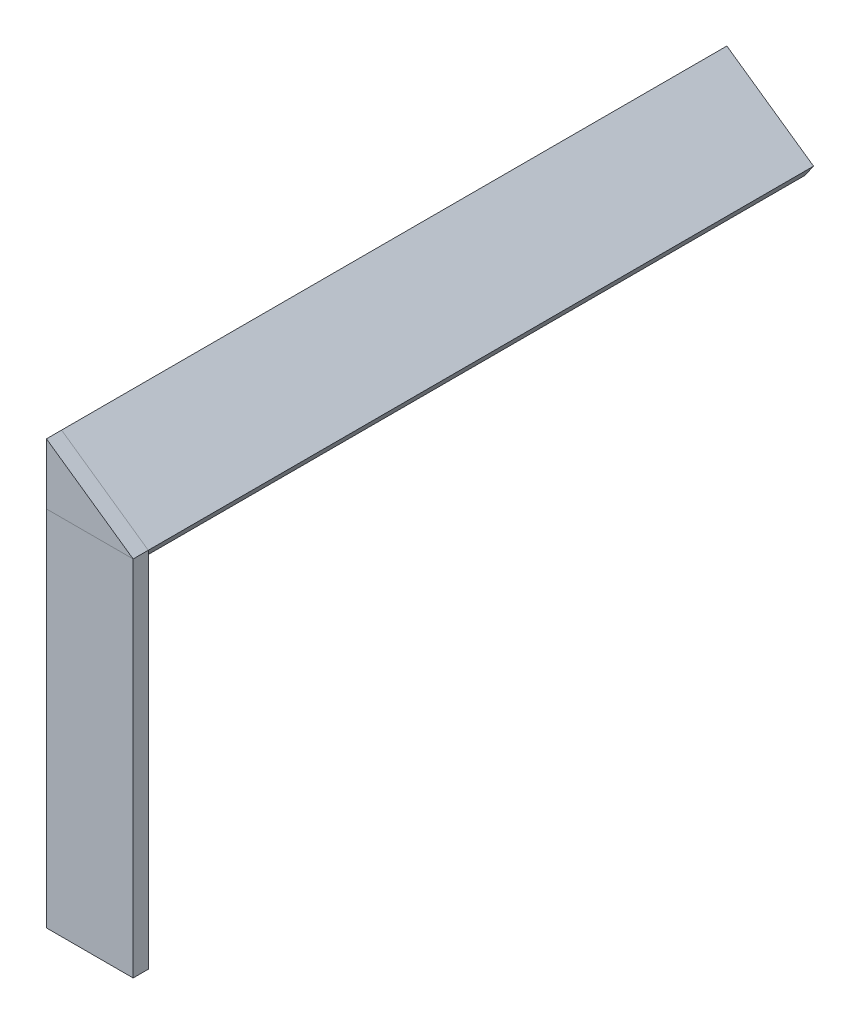
ISO-10303-21;
HEADER;
FILE_DESCRIPTION(('STEP AP214'),'2;1');
FILE_NAME('part.step','',(''),(''),'','','');
FILE_SCHEMA(('AUTOMOTIVE_DESIGN { 1 0 10303 214 1 1 1 1 }'));
ENDSEC;
DATA;
#1=APPLICATION_CONTEXT('core data for automotive mechanical design processes');
#2=APPLICATION_PROTOCOL_DEFINITION('international standard','automotive_design',2000,#1);
#3=PRODUCT_CONTEXT('',#1,'mechanical');
#4=PRODUCT('Part','Part','',(#3));
#5=PRODUCT_RELATED_PRODUCT_CATEGORY('part','',(#4));
#6=PRODUCT_DEFINITION_FORMATION('','',#4);
#7=PRODUCT_DEFINITION_CONTEXT('part definition',#1,'design');
#8=PRODUCT_DEFINITION('design','',#6,#7);
#9=PRODUCT_DEFINITION_SHAPE('','',#8);
#10=(LENGTH_UNIT() NAMED_UNIT(*) SI_UNIT(.MILLI.,.METRE.));
#11=(NAMED_UNIT(*) PLANE_ANGLE_UNIT() SI_UNIT($,.RADIAN.));
#12=(NAMED_UNIT(*) SI_UNIT($,.STERADIAN.) SOLID_ANGLE_UNIT());
#13=UNCERTAINTY_MEASURE_WITH_UNIT(LENGTH_MEASURE(1.E-05),#10,'distance_accuracy_value','');
#14=(GEOMETRIC_REPRESENTATION_CONTEXT(3) GLOBAL_UNCERTAINTY_ASSIGNED_CONTEXT((#13)) GLOBAL_UNIT_ASSIGNED_CONTEXT((#10,
#11,#12)) REPRESENTATION_CONTEXT('',''));
#15=CARTESIAN_POINT('',(0.,0.,0.));
#16=DIRECTION('',(0.,0.,1.));
#17=DIRECTION('',(1.,0.,0.));
#18=AXIS2_PLACEMENT_3D('',#15,#16,#17);
#19=CARTESIAN_POINT('',(-18.2056541843228,25.4954725958042,-279.4));
#20=DIRECTION('',(-0.819152044288989,0.57357643635105,0.));
#21=DIRECTION('',(-0.57357643635105,-0.819152044288989,0.));
#22=AXIS2_PLACEMENT_3D('',#19,#20,#21);
#23=PLANE('',#22);
#24=DIRECTION('',(-0.57357643635105,-0.819152044288989,0.));
#25=VECTOR('',#24,1.);
#26=CARTESIAN_POINT('',(-18.2056541843228,25.4954725958042,0.));
#27=LINE('',#26,#25);
#28=CARTESIAN_POINT('',(-18.2056541843228,25.4954725958042,0.));
#29=VERTEX_POINT('',#28);
#30=CARTESIAN_POINT('',(-21.8478645551519,20.2938571145691,0.));
#31=VERTEX_POINT('',#30);
#32=EDGE_CURVE('E124',#29,#31,#27,.T.);
#33=ORIENTED_EDGE('',*,*,#32,.F.);
#34=DIRECTION('',(0.,0.,1.));
#35=VECTOR('',#34,1.);
#36=CARTESIAN_POINT('',(-18.2056541843228,25.4954725958042,-279.4));
#37=LINE('',#36,#35);
#38=CARTESIAN_POINT('',(-18.2056541843228,25.4954725958042,-279.4));
#39=VERTEX_POINT('',#38);
#40=EDGE_CURVE('E13',#39,#29,#37,.T.);
#41=ORIENTED_EDGE('',*,*,#40,.F.);
#42=DIRECTION('',(-0.57357643635105,-0.819152044288989,0.));
#43=VECTOR('',#42,1.);
#44=CARTESIAN_POINT('',(-18.2056541843228,25.4954725958042,-279.4));
#45=LINE('',#44,#43);
#46=CARTESIAN_POINT('',(-21.8478645551519,20.2938571145691,-279.4));
#47=VERTEX_POINT('',#46);
#48=EDGE_CURVE('E115',#39,#47,#45,.T.);
#49=ORIENTED_EDGE('',*,*,#48,.T.);
#50=DIRECTION('',(0.,0.,1.));
#51=VECTOR('',#50,1.);
#52=CARTESIAN_POINT('',(-21.8478645551519,20.2938571145691,-279.4));
#53=LINE('',#52,#51);
#54=EDGE_CURVE('E57',#47,#31,#53,.T.);
#55=ORIENTED_EDGE('',*,*,#54,.T.);
#56=EDGE_LOOP('',(#33,#41,#49,#55));
#57=FACE_BOUND('',#56,.T.);
#58=ADVANCED_FACE('F54',(#57),#23,.T.);
#59=CARTESIAN_POINT('',(-18.2056541843228,25.4954725958042,-279.4));
#60=DIRECTION('',(0.57357643635105,0.819152044288989,0.));
#61=DIRECTION('',(-0.819152044288989,0.57357643635105,0.));
#62=AXIS2_PLACEMENT_3D('',#59,#60,#61);
#63=PLANE('',#62);
#64=DIRECTION('',(-0.819152044288989,0.57357643635105,0.));
#65=VECTOR('',#64,1.);
#66=CARTESIAN_POINT('',(-18.2056541843228,25.4954725958042,0.));
#67=LINE('',#66,#65);
#68=CARTESIAN_POINT('',(18.2056541843228,0.,0.));
#69=VERTEX_POINT('',#68);
#70=EDGE_CURVE('E118',#69,#29,#67,.T.);
#71=ORIENTED_EDGE('',*,*,#70,.F.);
#72=DIRECTION('',(0.,0.,1.));
#73=VECTOR('',#72,1.);
#74=CARTESIAN_POINT('',(18.2056541843228,0.,-279.4));
#75=LINE('',#74,#73);
#76=CARTESIAN_POINT('',(18.2056541843228,0.,-279.4));
#77=VERTEX_POINT('',#76);
#78=EDGE_CURVE('E64',#77,#69,#75,.T.);
#79=ORIENTED_EDGE('',*,*,#78,.F.);
#80=DIRECTION('',(-0.819152044288989,0.57357643635105,0.));
#81=VECTOR('',#80,1.);
#82=CARTESIAN_POINT('',(-18.2056541843228,25.4954725958042,-279.4));
#83=LINE('',#82,#81);
#84=EDGE_CURVE('E110',#77,#39,#83,.T.);
#85=ORIENTED_EDGE('',*,*,#84,.T.);
#86=ORIENTED_EDGE('',*,*,#40,.T.);
#87=EDGE_LOOP('',(#71,#79,#85,#86));
#88=FACE_BOUND('',#87,.T.);
#89=ADVANCED_FACE('F145',(#88),#63,.T.);
#90=CARTESIAN_POINT('',(18.2056541843228,0.,-279.4));
#91=DIRECTION('',(0.819152044288989,-0.57357643635105,0.));
#92=DIRECTION('',(0.57357643635105,0.819152044288989,0.));
#93=AXIS2_PLACEMENT_3D('',#90,#91,#92);
#94=PLANE('',#93);
#95=DIRECTION('',(0.57357643635105,0.819152044288989,0.));
#96=VECTOR('',#95,1.);
#97=CARTESIAN_POINT('',(18.2056541843228,0.,0.));
#98=LINE('',#97,#96);
#99=CARTESIAN_POINT('',(14.5634438134936,-5.20161548123509,0.));
#100=VERTEX_POINT('',#99);
#101=EDGE_CURVE('E104',#100,#69,#98,.T.);
#102=ORIENTED_EDGE('',*,*,#101,.F.);
#103=DIRECTION('',(0.,0.,1.));
#104=VECTOR('',#103,1.);
#105=CARTESIAN_POINT('',(14.5634438134936,-5.20161548123509,-279.4));
#106=LINE('',#105,#104);
#107=CARTESIAN_POINT('',(14.5634438134936,-5.20161548123509,-279.4));
#108=VERTEX_POINT('',#107);
#109=EDGE_CURVE('E99',#108,#100,#106,.T.);
#110=ORIENTED_EDGE('',*,*,#109,.F.);
#111=DIRECTION('',(0.57357643635105,0.819152044288989,0.));
#112=VECTOR('',#111,1.);
#113=CARTESIAN_POINT('',(18.2056541843228,0.,-279.4));
#114=LINE('',#113,#112);
#115=EDGE_CURVE('E102',#108,#77,#114,.T.);
#116=ORIENTED_EDGE('',*,*,#115,.T.);
#117=ORIENTED_EDGE('',*,*,#78,.T.);
#118=EDGE_LOOP('',(#102,#110,#116,#117));
#119=FACE_BOUND('',#118,.T.);
#120=ADVANCED_FACE('F101',(#119),#94,.T.);
#121=CARTESIAN_POINT('',(-21.8478645551519,20.2938571145691,-279.4));
#122=DIRECTION('',(-0.57357643635105,-0.819152044288989,0.));
#123=DIRECTION('',(0.819152044288989,-0.57357643635105,0.));
#124=AXIS2_PLACEMENT_3D('',#121,#122,#123);
#125=PLANE('',#124);
#126=DIRECTION('',(0.819152044288989,-0.57357643635105,0.));
#127=VECTOR('',#126,1.);
#128=CARTESIAN_POINT('',(-21.8478645551519,20.2938571145691,0.));
#129=LINE('',#128,#127);
#130=EDGE_CURVE('E138',#31,#100,#129,.T.);
#131=ORIENTED_EDGE('',*,*,#130,.F.);
#132=ORIENTED_EDGE('',*,*,#54,.F.);
#133=DIRECTION('',(0.819152044288989,-0.57357643635105,0.));
#134=VECTOR('',#133,1.);
#135=CARTESIAN_POINT('',(-21.8478645551519,20.2938571145691,-279.4));
#136=LINE('',#135,#134);
#137=EDGE_CURVE('E109',#47,#108,#136,.T.);
#138=ORIENTED_EDGE('',*,*,#137,.T.);
#139=ORIENTED_EDGE('',*,*,#109,.T.);
#140=EDGE_LOOP('',(#131,#132,#138,#139));
#141=FACE_BOUND('',#140,.T.);
#142=ADVANCED_FACE('F113',(#141),#125,.T.);
#143=CARTESIAN_POINT('',(0.,0.,-279.4));
#144=DIRECTION('',(0.,0.,1.));
#145=DIRECTION('',(1.,0.,0.));
#146=AXIS2_PLACEMENT_3D('',#143,#144,#145);
#147=PLANE('',#146);
#148=ORIENTED_EDGE('',*,*,#48,.F.);
#149=ORIENTED_EDGE('',*,*,#84,.F.);
#150=ORIENTED_EDGE('',*,*,#115,.F.);
#151=ORIENTED_EDGE('',*,*,#137,.F.);
#152=EDGE_LOOP('',(#148,#149,#150,#151));
#153=FACE_BOUND('',#152,.T.);
#154=ADVANCED_FACE('F108',(#153),#147,.F.);
#155=CARTESIAN_POINT('',(0.,0.,0.));
#156=DIRECTION('',(0.,0.,1.));
#157=DIRECTION('',(1.,0.,0.));
#158=AXIS2_PLACEMENT_3D('',#155,#156,#157);
#159=PLANE('',#158);
#160=ORIENTED_EDGE('',*,*,#32,.T.);
#161=ORIENTED_EDGE('',*,*,#130,.T.);
#162=ORIENTED_EDGE('',*,*,#101,.T.);
#163=ORIENTED_EDGE('',*,*,#70,.T.);
#164=EDGE_LOOP('',(#160,#161,#162,#163));
#165=FACE_BOUND('',#164,.T.);
#166=ADVANCED_FACE('F143',(#165),#159,.T.);
#167=CLOSED_SHELL('',(#58,#89,#120,#142,#154,#166));
#168=MANIFOLD_SOLID_BREP('B2',#167);
#169=CARTESIAN_POINT('',(-18.2056541843228,0.,6.35));
#170=DIRECTION('',(1.,0.,0.));
#171=DIRECTION('',(0.,1.,0.));
#172=AXIS2_PLACEMENT_3D('',#169,#170,#171);
#173=PLANE('',#172);
#174=DIRECTION('',(0.,-1.,0.));
#175=VECTOR('',#174,1.);
#176=CARTESIAN_POINT('',(-18.2056541843228,0.,0.));
#177=LINE('',#176,#175);
#178=CARTESIAN_POINT('',(-18.2056541843228,0.,0.));
#179=VERTEX_POINT('',#178);
#180=CARTESIAN_POINT('',(-18.2056541843228,-152.4,0.));
#181=VERTEX_POINT('',#180);
#182=EDGE_CURVE('E289',#179,#181,#177,.T.);
#183=ORIENTED_EDGE('',*,*,#182,.T.);
#184=DIRECTION('',(0.,0.,-1.));
#185=VECTOR('',#184,1.);
#186=CARTESIAN_POINT('',(-18.2056541843228,-152.4,6.35));
#187=LINE('',#186,#185);
#188=CARTESIAN_POINT('',(-18.2056541843228,-152.4,6.35));
#189=VERTEX_POINT('',#188);
#190=EDGE_CURVE('E52',#189,#181,#187,.T.);
#191=ORIENTED_EDGE('',*,*,#190,.F.);
#192=DIRECTION('',(0.,-1.,0.));
#193=VECTOR('',#192,1.);
#194=CARTESIAN_POINT('',(-18.2056541843228,0.,6.35));
#195=LINE('',#194,#193);
#196=CARTESIAN_POINT('',(-18.2056541843228,0.,6.35));
#197=VERTEX_POINT('',#196);
#198=EDGE_CURVE('E258',#197,#189,#195,.T.);
#199=ORIENTED_EDGE('',*,*,#198,.F.);
#200=DIRECTION('',(0.,0.,-1.));
#201=VECTOR('',#200,1.);
#202=CARTESIAN_POINT('',(-18.2056541843228,0.,6.35));
#203=LINE('',#202,#201);
#204=EDGE_CURVE('E269',#197,#179,#203,.T.);
#205=ORIENTED_EDGE('',*,*,#204,.T.);
#206=EDGE_LOOP('',(#183,#191,#199,#205));
#207=FACE_BOUND('',#206,.T.);
#208=ADVANCED_FACE('F207',(#207),#173,.F.);
#209=CARTESIAN_POINT('',(-18.2056541843228,-152.4,6.35));
#210=DIRECTION('',(0.,1.,0.));
#211=DIRECTION('',(0.,0.,1.));
#212=AXIS2_PLACEMENT_3D('',#209,#210,#211);
#213=PLANE('',#212);
#214=DIRECTION('',(1.,0.,0.));
#215=VECTOR('',#214,1.);
#216=CARTESIAN_POINT('',(-18.2056541843228,-152.4,0.));
#217=LINE('',#216,#215);
#218=CARTESIAN_POINT('',(18.2056541843228,-152.4,0.));
#219=VERTEX_POINT('',#218);
#220=EDGE_CURVE('E263',#181,#219,#217,.T.);
#221=ORIENTED_EDGE('',*,*,#220,.T.);
#222=DIRECTION('',(0.,0.,-1.));
#223=VECTOR('',#222,1.);
#224=CARTESIAN_POINT('',(18.2056541843228,-152.4,6.35));
#225=LINE('',#224,#223);
#226=CARTESIAN_POINT('',(18.2056541843228,-152.4,6.35));
#227=VERTEX_POINT('',#226);
#228=EDGE_CURVE('E215',#227,#219,#225,.T.);
#229=ORIENTED_EDGE('',*,*,#228,.F.);
#230=DIRECTION('',(1.,0.,0.));
#231=VECTOR('',#230,1.);
#232=CARTESIAN_POINT('',(-18.2056541843228,-152.4,6.35));
#233=LINE('',#232,#231);
#234=EDGE_CURVE('E253',#189,#227,#233,.T.);
#235=ORIENTED_EDGE('',*,*,#234,.F.);
#236=ORIENTED_EDGE('',*,*,#190,.T.);
#237=EDGE_LOOP('',(#221,#229,#235,#236));
#238=FACE_BOUND('',#237,.T.);
#239=ADVANCED_FACE('F262',(#238),#213,.F.);
#240=CARTESIAN_POINT('',(18.2056541843228,0.,6.35));
#241=DIRECTION('',(-1.,0.,0.));
#242=DIRECTION('',(0.,-1.,0.));
#243=AXIS2_PLACEMENT_3D('',#240,#241,#242);
#244=PLANE('',#243);
#245=DIRECTION('',(0.,1.,0.));
#246=VECTOR('',#245,1.);
#247=CARTESIAN_POINT('',(18.2056541843228,0.,0.));
#248=LINE('',#247,#246);
#249=CARTESIAN_POINT('',(18.2056541843228,0.,0.));
#250=VERTEX_POINT('',#249);
#251=EDGE_CURVE('E240',#219,#250,#248,.T.);
#252=ORIENTED_EDGE('',*,*,#251,.T.);
#253=DIRECTION('',(0.,0.,-1.));
#254=VECTOR('',#253,1.);
#255=CARTESIAN_POINT('',(18.2056541843228,0.,6.35));
#256=LINE('',#255,#254);
#257=CARTESIAN_POINT('',(18.2056541843228,0.,6.35));
#258=VERTEX_POINT('',#257);
#259=EDGE_CURVE('E264',#258,#250,#256,.T.);
#260=ORIENTED_EDGE('',*,*,#259,.F.);
#261=DIRECTION('',(0.,1.,0.));
#262=VECTOR('',#261,1.);
#263=CARTESIAN_POINT('',(18.2056541843228,0.,6.35));
#264=LINE('',#263,#262);
#265=EDGE_CURVE('E256',#227,#258,#264,.T.);
#266=ORIENTED_EDGE('',*,*,#265,.F.);
#267=ORIENTED_EDGE('',*,*,#228,.T.);
#268=EDGE_LOOP('',(#252,#260,#266,#267));
#269=FACE_BOUND('',#268,.T.);
#270=ADVANCED_FACE('F265',(#269),#244,.F.);
#271=CARTESIAN_POINT('',(-18.2056541843228,0.,6.35));
#272=DIRECTION('',(0.,-1.,0.));
#273=DIRECTION('',(1.,0.,0.));
#274=AXIS2_PLACEMENT_3D('',#271,#272,#273);
#275=PLANE('',#274);
#276=DIRECTION('',(-1.,0.,0.));
#277=VECTOR('',#276,1.);
#278=CARTESIAN_POINT('',(-18.2056541843228,0.,0.));
#279=LINE('',#278,#277);
#280=EDGE_CURVE('E246',#250,#179,#279,.T.);
#281=ORIENTED_EDGE('',*,*,#280,.T.);
#282=ORIENTED_EDGE('',*,*,#204,.F.);
#283=DIRECTION('',(-1.,0.,0.));
#284=VECTOR('',#283,1.);
#285=CARTESIAN_POINT('',(-18.2056541843228,0.,6.35));
#286=LINE('',#285,#284);
#287=EDGE_CURVE('E223',#258,#197,#286,.T.);
#288=ORIENTED_EDGE('',*,*,#287,.F.);
#289=ORIENTED_EDGE('',*,*,#259,.T.);
#290=EDGE_LOOP('',(#281,#282,#288,#289));
#291=FACE_BOUND('',#290,.T.);
#292=ADVANCED_FACE('F284',(#291),#275,.F.);
#293=CARTESIAN_POINT('',(0.,0.,6.35));
#294=DIRECTION('',(0.,0.,1.));
#295=DIRECTION('',(1.,0.,0.));
#296=AXIS2_PLACEMENT_3D('',#293,#294,#295);
#297=PLANE('',#296);
#298=ORIENTED_EDGE('',*,*,#198,.T.);
#299=ORIENTED_EDGE('',*,*,#234,.T.);
#300=ORIENTED_EDGE('',*,*,#265,.T.);
#301=ORIENTED_EDGE('',*,*,#287,.T.);
#302=EDGE_LOOP('',(#298,#299,#300,#301));
#303=FACE_BOUND('',#302,.T.);
#304=ADVANCED_FACE('F254',(#303),#297,.T.);
#305=CARTESIAN_POINT('',(0.,0.,0.));
#306=DIRECTION('',(0.,0.,1.));
#307=DIRECTION('',(1.,0.,0.));
#308=AXIS2_PLACEMENT_3D('',#305,#306,#307);
#309=PLANE('',#308);
#310=ORIENTED_EDGE('',*,*,#182,.F.);
#311=ORIENTED_EDGE('',*,*,#280,.F.);
#312=ORIENTED_EDGE('',*,*,#251,.F.);
#313=ORIENTED_EDGE('',*,*,#220,.F.);
#314=EDGE_LOOP('',(#310,#311,#312,#313));
#315=FACE_BOUND('',#314,.T.);
#316=ADVANCED_FACE('F287',(#315),#309,.F.);
#317=CLOSED_SHELL('',(#208,#239,#270,#292,#304,#316));
#318=MANIFOLD_SOLID_BREP('B7',#317);
#319=CARTESIAN_POINT('',(-18.2056541843228,0.,6.35));
#320=DIRECTION('',(1.,0.,0.));
#321=DIRECTION('',(0.,1.,0.));
#322=AXIS2_PLACEMENT_3D('',#319,#320,#321);
#323=PLANE('',#322);
#324=DIRECTION('',(0.,-1.,0.));
#325=VECTOR('',#324,1.);
#326=CARTESIAN_POINT('',(-18.2056541843228,0.,0.));
#327=LINE('',#326,#325);
#328=CARTESIAN_POINT('',(-18.2056541843228,25.4954725958042,0.));
#329=VERTEX_POINT('',#328);
#330=CARTESIAN_POINT('',(-18.2056541843228,0.,0.));
#331=VERTEX_POINT('',#330);
#332=EDGE_CURVE('E391',#329,#331,#327,.T.);
#333=ORIENTED_EDGE('',*,*,#332,.T.);
#334=DIRECTION('',(0.,0.,-1.));
#335=VECTOR('',#334,1.);
#336=CARTESIAN_POINT('',(-18.2056541843228,0.,6.35));
#337=LINE('',#336,#335);
#338=CARTESIAN_POINT('',(-18.2056541843228,0.,6.35));
#339=VERTEX_POINT('',#338);
#340=EDGE_CURVE('E205',#339,#331,#337,.T.);
#341=ORIENTED_EDGE('',*,*,#340,.F.);
#342=DIRECTION('',(0.,-1.,0.));
#343=VECTOR('',#342,1.);
#344=CARTESIAN_POINT('',(-18.2056541843228,0.,6.35));
#345=LINE('',#344,#343);
#346=CARTESIAN_POINT('',(-18.2056541843228,25.4954725958042,6.35));
#347=VERTEX_POINT('',#346);
#348=EDGE_CURVE('E383',#347,#339,#345,.T.);
#349=ORIENTED_EDGE('',*,*,#348,.F.);
#350=DIRECTION('',(0.,0.,-1.));
#351=VECTOR('',#350,1.);
#352=CARTESIAN_POINT('',(-18.2056541843228,25.4954725958042,6.35));
#353=LINE('',#352,#351);
#354=EDGE_CURVE('E392',#347,#329,#353,.T.);
#355=ORIENTED_EDGE('',*,*,#354,.T.);
#356=EDGE_LOOP('',(#333,#341,#349,#355));
#357=FACE_BOUND('',#356,.T.);
#358=ADVANCED_FACE('F342',(#357),#323,.F.);
#359=CARTESIAN_POINT('',(18.2056541843228,0.,6.35));
#360=DIRECTION('',(0.,1.,0.));
#361=DIRECTION('',(-1.,0.,0.));
#362=AXIS2_PLACEMENT_3D('',#359,#360,#361);
#363=PLANE('',#362);
#364=DIRECTION('',(1.,0.,0.));
#365=VECTOR('',#364,1.);
#366=CARTESIAN_POINT('',(18.2056541843228,0.,0.));
#367=LINE('',#366,#365);
#368=CARTESIAN_POINT('',(18.2056541843228,0.,0.));
#369=VERTEX_POINT('',#368);
#370=EDGE_CURVE('E370',#331,#369,#367,.T.);
#371=ORIENTED_EDGE('',*,*,#370,.T.);
#372=DIRECTION('',(0.,0.,-1.));
#373=VECTOR('',#372,1.);
#374=CARTESIAN_POINT('',(18.2056541843228,0.,6.35));
#375=LINE('',#374,#373);
#376=CARTESIAN_POINT('',(18.2056541843228,0.,6.35));
#377=VERTEX_POINT('',#376);
#378=EDGE_CURVE('E350',#377,#369,#375,.T.);
#379=ORIENTED_EDGE('',*,*,#378,.F.);
#380=DIRECTION('',(1.,0.,0.));
#381=VECTOR('',#380,1.);
#382=CARTESIAN_POINT('',(18.2056541843228,0.,6.35));
#383=LINE('',#382,#381);
#384=EDGE_CURVE('E378',#339,#377,#383,.T.);
#385=ORIENTED_EDGE('',*,*,#384,.F.);
#386=ORIENTED_EDGE('',*,*,#340,.T.);
#387=EDGE_LOOP('',(#371,#379,#385,#386));
#388=FACE_BOUND('',#387,.T.);
#389=ADVANCED_FACE('F379',(#388),#363,.F.);
#390=CARTESIAN_POINT('',(-18.2056541843228,25.4954725958042,6.35));
#391=DIRECTION('',(-0.57357643635105,-0.819152044288989,0.));
#392=DIRECTION('',(0.819152044288989,-0.57357643635105,0.));
#393=AXIS2_PLACEMENT_3D('',#390,#391,#392);
#394=PLANE('',#393);
#395=DIRECTION('',(-0.819152044288989,0.57357643635105,0.));
#396=VECTOR('',#395,1.);
#397=CARTESIAN_POINT('',(-18.2056541843228,25.4954725958042,0.));
#398=LINE('',#397,#396);
#399=EDGE_CURVE('E375',#369,#329,#398,.T.);
#400=ORIENTED_EDGE('',*,*,#399,.T.);
#401=ORIENTED_EDGE('',*,*,#354,.F.);
#402=DIRECTION('',(-0.819152044288989,0.57357643635105,0.));
#403=VECTOR('',#402,1.);
#404=CARTESIAN_POINT('',(-18.2056541843228,25.4954725958042,6.35));
#405=LINE('',#404,#403);
#406=EDGE_CURVE('E358',#377,#347,#405,.T.);
#407=ORIENTED_EDGE('',*,*,#406,.F.);
#408=ORIENTED_EDGE('',*,*,#378,.T.);
#409=EDGE_LOOP('',(#400,#401,#407,#408));
#410=FACE_BOUND('',#409,.T.);
#411=ADVANCED_FACE('F399',(#410),#394,.F.);
#412=CARTESIAN_POINT('',(0.,0.,6.35));
#413=DIRECTION('',(0.,0.,1.));
#414=DIRECTION('',(1.,0.,0.));
#415=AXIS2_PLACEMENT_3D('',#412,#413,#414);
#416=PLANE('',#415);
#417=ORIENTED_EDGE('',*,*,#348,.T.);
#418=ORIENTED_EDGE('',*,*,#384,.T.);
#419=ORIENTED_EDGE('',*,*,#406,.T.);
#420=EDGE_LOOP('',(#417,#418,#419));
#421=FACE_BOUND('',#420,.T.);
#422=ADVANCED_FACE('F386',(#421),#416,.T.);
#423=CARTESIAN_POINT('',(0.,0.,0.));
#424=DIRECTION('',(0.,0.,1.));
#425=DIRECTION('',(1.,0.,0.));
#426=AXIS2_PLACEMENT_3D('',#423,#424,#425);
#427=PLANE('',#426);
#428=ORIENTED_EDGE('',*,*,#332,.F.);
#429=ORIENTED_EDGE('',*,*,#399,.F.);
#430=ORIENTED_EDGE('',*,*,#370,.F.);
#431=EDGE_LOOP('',(#428,#429,#430));
#432=FACE_BOUND('',#431,.T.);
#433=ADVANCED_FACE('F400',(#432),#427,.F.);
#434=CLOSED_SHELL('',(#358,#389,#411,#422,#433));
#435=MANIFOLD_SOLID_BREP('B46',#434);
#436=ADVANCED_BREP_SHAPE_REPRESENTATION('',(#18,#168,#318,#435),#14);
#437=SHAPE_DEFINITION_REPRESENTATION(#9,#436);
ENDSEC;
END-ISO-10303-21;
